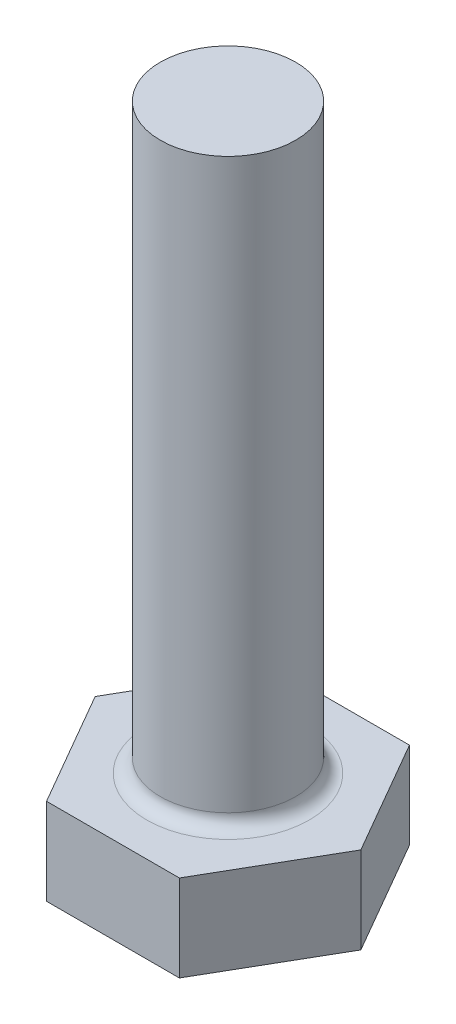
ISO-10303-21;
HEADER;
FILE_DESCRIPTION(('STEP AP214'),'2;1');
FILE_NAME('part.step','',(''),(''),'','','');
FILE_SCHEMA(('AUTOMOTIVE_DESIGN { 1 0 10303 214 1 1 1 1 }'));
ENDSEC;
DATA;
#1=APPLICATION_CONTEXT('core data for automotive mechanical design processes');
#2=APPLICATION_PROTOCOL_DEFINITION('international standard','automotive_design',2000,#1);
#3=PRODUCT_CONTEXT('',#1,'mechanical');
#4=PRODUCT('Part','Part','',(#3));
#5=PRODUCT_RELATED_PRODUCT_CATEGORY('part','',(#4));
#6=PRODUCT_DEFINITION_FORMATION('','',#4);
#7=PRODUCT_DEFINITION_CONTEXT('part definition',#1,'design');
#8=PRODUCT_DEFINITION('design','',#6,#7);
#9=PRODUCT_DEFINITION_SHAPE('','',#8);
#10=(LENGTH_UNIT() NAMED_UNIT(*) SI_UNIT(.MILLI.,.METRE.));
#11=(NAMED_UNIT(*) PLANE_ANGLE_UNIT() SI_UNIT($,.RADIAN.));
#12=(NAMED_UNIT(*) SI_UNIT($,.STERADIAN.) SOLID_ANGLE_UNIT());
#13=UNCERTAINTY_MEASURE_WITH_UNIT(LENGTH_MEASURE(1.E-05),#10,'distance_accuracy_value','');
#14=(GEOMETRIC_REPRESENTATION_CONTEXT(3) GLOBAL_UNCERTAINTY_ASSIGNED_CONTEXT((#13)) GLOBAL_UNIT_ASSIGNED_CONTEXT((#10,
#11,#12)) REPRESENTATION_CONTEXT('',''));
#15=CARTESIAN_POINT('',(0.,0.,0.));
#16=DIRECTION('',(0.,0.,1.));
#17=DIRECTION('',(1.,0.,0.));
#18=AXIS2_PLACEMENT_3D('',#15,#16,#17);
#19=CARTESIAN_POINT('',(0.,43.,0.));
#20=DIRECTION('',(0.,-1.,0.));
#21=DIRECTION('',(0.,0.,-1.));
#22=AXIS2_PLACEMENT_3D('',#19,#20,#21);
#23=CYLINDRICAL_SURFACE('',#22,5.);
#24=CARTESIAN_POINT('',(0.,1.,0.));
#25=DIRECTION('',(0.,-1.,0.));
#26=DIRECTION('',(0.,0.,-1.));
#27=AXIS2_PLACEMENT_3D('',#24,#25,#26);
#28=CIRCLE('',#27,5.);
#29=CARTESIAN_POINT('',(0.,1.,-5.));
#30=VERTEX_POINT('',#29);
#31=EDGE_CURVE('E46',#30,#30,#28,.F.);
#32=ORIENTED_EDGE('',*,*,#31,.T.);
#33=EDGE_LOOP('',(#32));
#34=FACE_BOUND('',#33,.T.);
#35=CARTESIAN_POINT('',(0.,43.,0.));
#36=DIRECTION('',(0.,1.,0.));
#37=DIRECTION('',(0.,0.,1.));
#38=AXIS2_PLACEMENT_3D('',#35,#36,#37);
#39=CIRCLE('',#38,5.);
#40=CARTESIAN_POINT('',(0.,43.,5.));
#41=VERTEX_POINT('',#40);
#42=EDGE_CURVE('E142',#41,#41,#39,.T.);
#43=ORIENTED_EDGE('',*,*,#42,.F.);
#44=EDGE_LOOP('',(#43));
#45=FACE_BOUND('',#44,.T.);
#46=ADVANCED_FACE('F37',(#34,#45),#23,.T.);
#47=CARTESIAN_POINT('',(0.,43.,0.));
#48=DIRECTION('',(0.,1.,0.));
#49=DIRECTION('',(0.,0.,1.));
#50=AXIS2_PLACEMENT_3D('',#47,#48,#49);
#51=PLANE('',#50);
#52=ORIENTED_EDGE('',*,*,#42,.T.);
#53=EDGE_LOOP('',(#52));
#54=FACE_BOUND('',#53,.T.);
#55=ADVANCED_FACE('F159',(#54),#51,.T.);
#56=CARTESIAN_POINT('',(9.81495457622364,-6.4,0.));
#57=DIRECTION('',(-0.866025403784438,0.,-0.5));
#58=DIRECTION('',(-0.5,0.,0.866025403784439));
#59=AXIS2_PLACEMENT_3D('',#56,#57,#58);
#60=PLANE('',#59);
#61=DIRECTION('',(-0.5,0.,0.866025403784438));
#62=VECTOR('',#61,1.);
#63=CARTESIAN_POINT('',(9.81495457622364,0.,0.));
#64=LINE('',#63,#62);
#65=CARTESIAN_POINT('',(9.81495457622364,0.,0.));
#66=VERTEX_POINT('',#65);
#67=CARTESIAN_POINT('',(4.90747728811182,0.,8.5));
#68=VERTEX_POINT('',#67);
#69=EDGE_CURVE('E123',#66,#68,#64,.T.);
#70=ORIENTED_EDGE('',*,*,#69,.T.);
#71=DIRECTION('',(0.,1.,0.));
#72=VECTOR('',#71,1.);
#73=CARTESIAN_POINT('',(4.90747728811182,-6.4,8.5));
#74=LINE('',#73,#72);
#75=CARTESIAN_POINT('',(4.90747728811182,-6.4,8.5));
#76=VERTEX_POINT('',#75);
#77=EDGE_CURVE('E140',#76,#68,#74,.T.);
#78=ORIENTED_EDGE('',*,*,#77,.F.);
#79=DIRECTION('',(-0.5,0.,0.866025403784438));
#80=VECTOR('',#79,1.);
#81=CARTESIAN_POINT('',(9.81495457622364,-6.4,0.));
#82=LINE('',#81,#80);
#83=CARTESIAN_POINT('',(9.81495457622364,-6.4,0.));
#84=VERTEX_POINT('',#83);
#85=EDGE_CURVE('E133',#84,#76,#82,.T.);
#86=ORIENTED_EDGE('',*,*,#85,.F.);
#87=DIRECTION('',(0.,1.,0.));
#88=VECTOR('',#87,1.);
#89=CARTESIAN_POINT('',(9.81495457622364,-6.4,0.));
#90=LINE('',#89,#88);
#91=EDGE_CURVE('E119',#84,#66,#90,.T.);
#92=ORIENTED_EDGE('',*,*,#91,.T.);
#93=EDGE_LOOP('',(#70,#78,#86,#92));
#94=FACE_BOUND('',#93,.T.);
#95=ADVANCED_FACE('F163',(#94),#60,.F.);
#96=CARTESIAN_POINT('',(4.90747728811182,-6.4,8.5));
#97=DIRECTION('',(0.,0.,-1.));
#98=DIRECTION('',(-1.,0.,0.));
#99=AXIS2_PLACEMENT_3D('',#96,#97,#98);
#100=PLANE('',#99);
#101=DIRECTION('',(-1.,0.,0.));
#102=VECTOR('',#101,1.);
#103=CARTESIAN_POINT('',(4.90747728811182,0.,8.5));
#104=LINE('',#103,#102);
#105=CARTESIAN_POINT('',(-4.90747728811182,0.,8.5));
#106=VERTEX_POINT('',#105);
#107=EDGE_CURVE('E126',#68,#106,#104,.T.);
#108=ORIENTED_EDGE('',*,*,#107,.T.);
#109=DIRECTION('',(0.,1.,0.));
#110=VECTOR('',#109,1.);
#111=CARTESIAN_POINT('',(-4.90747728811182,-6.4,8.5));
#112=LINE('',#111,#110);
#113=CARTESIAN_POINT('',(-4.90747728811182,-6.4,8.5));
#114=VERTEX_POINT('',#113);
#115=EDGE_CURVE('E137',#114,#106,#112,.T.);
#116=ORIENTED_EDGE('',*,*,#115,.F.);
#117=DIRECTION('',(-1.,0.,0.));
#118=VECTOR('',#117,1.);
#119=CARTESIAN_POINT('',(4.90747728811182,-6.4,8.5));
#120=LINE('',#119,#118);
#121=EDGE_CURVE('E92',#76,#114,#120,.T.);
#122=ORIENTED_EDGE('',*,*,#121,.F.);
#123=ORIENTED_EDGE('',*,*,#77,.T.);
#124=EDGE_LOOP('',(#108,#116,#122,#123));
#125=FACE_BOUND('',#124,.T.);
#126=ADVANCED_FACE('F169',(#125),#100,.F.);
#127=CARTESIAN_POINT('',(-4.90747728811182,-6.4,8.5));
#128=DIRECTION('',(0.866025403784439,0.,-0.5));
#129=DIRECTION('',(-0.5,0.,-0.866025403784439));
#130=AXIS2_PLACEMENT_3D('',#127,#128,#129);
#131=PLANE('',#130);
#132=DIRECTION('',(-0.5,0.,-0.866025403784439));
#133=VECTOR('',#132,1.);
#134=CARTESIAN_POINT('',(-4.90747728811182,0.,8.5));
#135=LINE('',#134,#133);
#136=CARTESIAN_POINT('',(-9.81495457622364,0.,0.));
#137=VERTEX_POINT('',#136);
#138=EDGE_CURVE('E128',#106,#137,#135,.T.);
#139=ORIENTED_EDGE('',*,*,#138,.T.);
#140=DIRECTION('',(0.,1.,0.));
#141=VECTOR('',#140,1.);
#142=CARTESIAN_POINT('',(-9.81495457622364,-6.4,0.));
#143=LINE('',#142,#141);
#144=CARTESIAN_POINT('',(-9.81495457622364,-6.4,0.));
#145=VERTEX_POINT('',#144);
#146=EDGE_CURVE('E114',#145,#137,#143,.T.);
#147=ORIENTED_EDGE('',*,*,#146,.F.);
#148=DIRECTION('',(-0.5,0.,-0.866025403784439));
#149=VECTOR('',#148,1.);
#150=CARTESIAN_POINT('',(-4.90747728811182,-6.4,8.5));
#151=LINE('',#150,#149);
#152=EDGE_CURVE('E105',#114,#145,#151,.T.);
#153=ORIENTED_EDGE('',*,*,#152,.F.);
#154=ORIENTED_EDGE('',*,*,#115,.T.);
#155=EDGE_LOOP('',(#139,#147,#153,#154));
#156=FACE_BOUND('',#155,.T.);
#157=ADVANCED_FACE('F173',(#156),#131,.F.);
#158=CARTESIAN_POINT('',(-9.81495457622364,-6.4,0.));
#159=DIRECTION('',(0.866025403784439,0.,0.5));
#160=DIRECTION('',(0.5,0.,-0.866025403784439));
#161=AXIS2_PLACEMENT_3D('',#158,#159,#160);
#162=PLANE('',#161);
#163=DIRECTION('',(0.5,0.,-0.866025403784439));
#164=VECTOR('',#163,1.);
#165=CARTESIAN_POINT('',(-9.81495457622364,0.,0.));
#166=LINE('',#165,#164);
#167=CARTESIAN_POINT('',(-4.90747728811182,0.,-8.5));
#168=VERTEX_POINT('',#167);
#169=EDGE_CURVE('E113',#137,#168,#166,.T.);
#170=ORIENTED_EDGE('',*,*,#169,.T.);
#171=DIRECTION('',(0.,1.,0.));
#172=VECTOR('',#171,1.);
#173=CARTESIAN_POINT('',(-4.90747728811182,-6.4,-8.5));
#174=LINE('',#173,#172);
#175=CARTESIAN_POINT('',(-4.90747728811182,-6.4,-8.5));
#176=VERTEX_POINT('',#175);
#177=EDGE_CURVE('E110',#176,#168,#174,.T.);
#178=ORIENTED_EDGE('',*,*,#177,.F.);
#179=DIRECTION('',(0.5,0.,-0.866025403784439));
#180=VECTOR('',#179,1.);
#181=CARTESIAN_POINT('',(-9.81495457622364,-6.4,0.));
#182=LINE('',#181,#180);
#183=EDGE_CURVE('E99',#145,#176,#182,.T.);
#184=ORIENTED_EDGE('',*,*,#183,.F.);
#185=ORIENTED_EDGE('',*,*,#146,.T.);
#186=EDGE_LOOP('',(#170,#178,#184,#185));
#187=FACE_BOUND('',#186,.T.);
#188=ADVANCED_FACE('F111',(#187),#162,.F.);
#189=CARTESIAN_POINT('',(-4.90747728811182,-6.4,-8.5));
#190=DIRECTION('',(0.,0.,1.));
#191=DIRECTION('',(1.,0.,0.));
#192=AXIS2_PLACEMENT_3D('',#189,#190,#191);
#193=PLANE('',#192);
#194=DIRECTION('',(1.,0.,0.));
#195=VECTOR('',#194,1.);
#196=CARTESIAN_POINT('',(-4.90747728811182,0.,-8.5));
#197=LINE('',#196,#195);
#198=CARTESIAN_POINT('',(4.90747728811182,0.,-8.5));
#199=VERTEX_POINT('',#198);
#200=EDGE_CURVE('E77',#168,#199,#197,.T.);
#201=ORIENTED_EDGE('',*,*,#200,.T.);
#202=DIRECTION('',(0.,1.,0.));
#203=VECTOR('',#202,1.);
#204=CARTESIAN_POINT('',(4.90747728811182,-6.4,-8.5));
#205=LINE('',#204,#203);
#206=CARTESIAN_POINT('',(4.90747728811182,-6.4,-8.5));
#207=VERTEX_POINT('',#206);
#208=EDGE_CURVE('E115',#207,#199,#205,.T.);
#209=ORIENTED_EDGE('',*,*,#208,.F.);
#210=DIRECTION('',(1.,0.,0.));
#211=VECTOR('',#210,1.);
#212=CARTESIAN_POINT('',(-4.90747728811182,-6.4,-8.5));
#213=LINE('',#212,#211);
#214=EDGE_CURVE('E103',#176,#207,#213,.T.);
#215=ORIENTED_EDGE('',*,*,#214,.F.);
#216=ORIENTED_EDGE('',*,*,#177,.T.);
#217=EDGE_LOOP('',(#201,#209,#215,#216));
#218=FACE_BOUND('',#217,.T.);
#219=ADVANCED_FACE('F117',(#218),#193,.F.);
#220=CARTESIAN_POINT('',(4.90747728811182,-6.4,-8.5));
#221=DIRECTION('',(-0.866025403784439,0.,0.5));
#222=DIRECTION('',(0.5,0.,0.866025403784439));
#223=AXIS2_PLACEMENT_3D('',#220,#221,#222);
#224=PLANE('',#223);
#225=DIRECTION('',(0.5,0.,0.866025403784439));
#226=VECTOR('',#225,1.);
#227=CARTESIAN_POINT('',(4.90747728811182,0.,-8.5));
#228=LINE('',#227,#226);
#229=EDGE_CURVE('E83',#199,#66,#228,.T.);
#230=ORIENTED_EDGE('',*,*,#229,.T.);
#231=ORIENTED_EDGE('',*,*,#91,.F.);
#232=DIRECTION('',(0.5,0.,0.866025403784439));
#233=VECTOR('',#232,1.);
#234=CARTESIAN_POINT('',(4.90747728811182,-6.4,-8.5));
#235=LINE('',#234,#233);
#236=EDGE_CURVE('E54',#207,#84,#235,.T.);
#237=ORIENTED_EDGE('',*,*,#236,.F.);
#238=ORIENTED_EDGE('',*,*,#208,.T.);
#239=EDGE_LOOP('',(#230,#231,#237,#238));
#240=FACE_BOUND('',#239,.T.);
#241=ADVANCED_FACE('F181',(#240),#224,.F.);
#242=CARTESIAN_POINT('',(0.,-6.4,0.));
#243=DIRECTION('',(0.,-1.,0.));
#244=DIRECTION('',(0.,0.,-1.));
#245=AXIS2_PLACEMENT_3D('',#242,#243,#244);
#246=PLANE('',#245);
#247=ORIENTED_EDGE('',*,*,#85,.T.);
#248=ORIENTED_EDGE('',*,*,#121,.T.);
#249=ORIENTED_EDGE('',*,*,#152,.T.);
#250=ORIENTED_EDGE('',*,*,#183,.T.);
#251=ORIENTED_EDGE('',*,*,#214,.T.);
#252=ORIENTED_EDGE('',*,*,#236,.T.);
#253=EDGE_LOOP('',(#247,#248,#249,#250,#251,#252));
#254=FACE_BOUND('',#253,.T.);
#255=ADVANCED_FACE('F101',(#254),#246,.T.);
#256=CARTESIAN_POINT('',(0.,0.,0.));
#257=DIRECTION('',(0.,-1.,0.));
#258=DIRECTION('',(0.,0.,-1.));
#259=AXIS2_PLACEMENT_3D('',#256,#257,#258);
#260=PLANE('',#259);
#261=CARTESIAN_POINT('',(0.,0.,0.));
#262=DIRECTION('',(0.,-1.,0.));
#263=DIRECTION('',(0.,0.,-1.));
#264=AXIS2_PLACEMENT_3D('',#261,#262,#263);
#265=CIRCLE('',#264,6.);
#266=CARTESIAN_POINT('',(0.,0.,-6.));
#267=VERTEX_POINT('',#266);
#268=EDGE_CURVE('E11',#267,#267,#265,.T.);
#269=ORIENTED_EDGE('',*,*,#268,.T.);
#270=EDGE_LOOP('',(#269));
#271=FACE_BOUND('',#270,.T.);
#272=ORIENTED_EDGE('',*,*,#69,.F.);
#273=ORIENTED_EDGE('',*,*,#229,.F.);
#274=ORIENTED_EDGE('',*,*,#200,.F.);
#275=ORIENTED_EDGE('',*,*,#169,.F.);
#276=ORIENTED_EDGE('',*,*,#138,.F.);
#277=ORIENTED_EDGE('',*,*,#107,.F.);
#278=EDGE_LOOP('',(#272,#273,#274,#275,#276,#277));
#279=FACE_BOUND('',#278,.T.);
#280=ADVANCED_FACE('F150',(#271,#279),#260,.F.);
#281=CARTESIAN_POINT('',(0.,1.,0.));
#282=DIRECTION('',(0.,-1.,0.));
#283=DIRECTION('',(0.,0.,-1.));
#284=AXIS2_PLACEMENT_3D('',#281,#282,#283);
#285=TOROIDAL_SURFACE('',#284,6.,1.);
#286=ORIENTED_EDGE('',*,*,#268,.F.);
#287=EDGE_LOOP('',(#286));
#288=FACE_BOUND('',#287,.T.);
#289=ORIENTED_EDGE('',*,*,#31,.F.);
#290=EDGE_LOOP('',(#289));
#291=FACE_BOUND('',#290,.T.);
#292=ADVANCED_FACE('F39',(#288,#291),#285,.F.);
#293=CLOSED_SHELL('',(#46,#55,#95,#126,#157,#188,#219,#241,#255,#280,#292));
#294=MANIFOLD_SOLID_BREP('B2',#293);
#295=ADVANCED_BREP_SHAPE_REPRESENTATION('',(#18,#294),#14);
#296=SHAPE_DEFINITION_REPRESENTATION(#9,#295);
ENDSEC;
END-ISO-10303-21;
